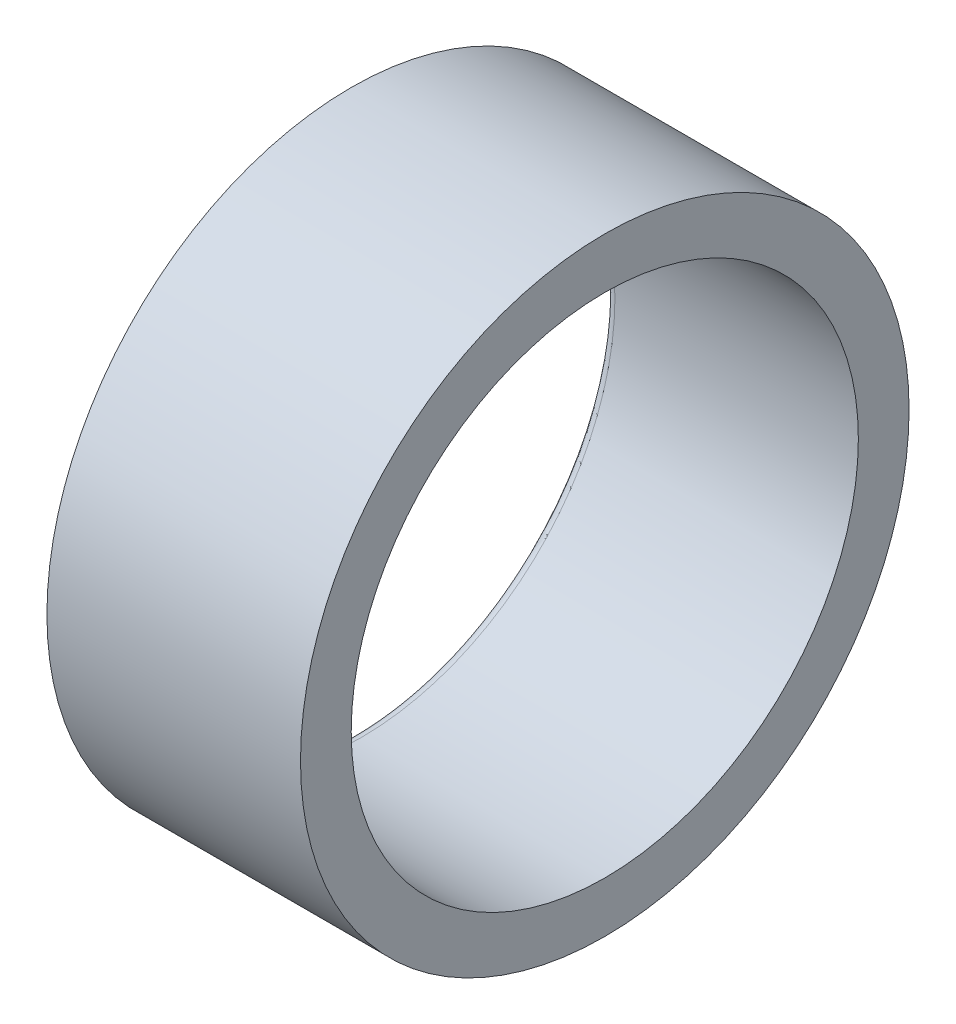
ISO-10303-21;
HEADER;
FILE_DESCRIPTION(('STEP AP214'),'2;1');
FILE_NAME('part.step','',(''),(''),'','','');
FILE_SCHEMA(('AUTOMOTIVE_DESIGN { 1 0 10303 214 1 1 1 1 }'));
ENDSEC;
DATA;
#1=APPLICATION_CONTEXT('core data for automotive mechanical design processes');
#2=APPLICATION_PROTOCOL_DEFINITION('international standard','automotive_design',2000,#1);
#3=PRODUCT_CONTEXT('',#1,'mechanical');
#4=PRODUCT('Part','Part','',(#3));
#5=PRODUCT_RELATED_PRODUCT_CATEGORY('part','',(#4));
#6=PRODUCT_DEFINITION_FORMATION('','',#4);
#7=PRODUCT_DEFINITION_CONTEXT('part definition',#1,'design');
#8=PRODUCT_DEFINITION('design','',#6,#7);
#9=PRODUCT_DEFINITION_SHAPE('','',#8);
#10=(LENGTH_UNIT() NAMED_UNIT(*) SI_UNIT(.MILLI.,.METRE.));
#11=(NAMED_UNIT(*) PLANE_ANGLE_UNIT() SI_UNIT($,.RADIAN.));
#12=(NAMED_UNIT(*) SI_UNIT($,.STERADIAN.) SOLID_ANGLE_UNIT());
#13=UNCERTAINTY_MEASURE_WITH_UNIT(LENGTH_MEASURE(1.E-05),#10,'distance_accuracy_value','');
#14=(GEOMETRIC_REPRESENTATION_CONTEXT(3) GLOBAL_UNCERTAINTY_ASSIGNED_CONTEXT((#13)) GLOBAL_UNIT_ASSIGNED_CONTEXT((#10,
#11,#12)) REPRESENTATION_CONTEXT('',''));
#15=CARTESIAN_POINT('',(0.,0.,0.));
#16=DIRECTION('',(0.,0.,1.));
#17=DIRECTION('',(1.,0.,0.));
#18=AXIS2_PLACEMENT_3D('',#15,#16,#17);
#19=CARTESIAN_POINT('',(5.,5.2,0.));
#20=DIRECTION('',(-1.,0.,0.));
#21=DIRECTION('',(0.,0.,1.));
#22=AXIS2_PLACEMENT_3D('',#19,#20,#21);
#23=PLANE('',#22);
#24=CARTESIAN_POINT('',(5.,0.,0.));
#25=DIRECTION('',(-1.,0.,0.));
#26=DIRECTION('',(0.,0.,1.));
#27=AXIS2_PLACEMENT_3D('',#24,#25,#26);
#28=CIRCLE('',#27,6.);
#29=CARTESIAN_POINT('',(5.,0.,6.));
#30=VERTEX_POINT('',#29);
#31=EDGE_CURVE('E25',#30,#30,#28,.T.);
#32=ORIENTED_EDGE('',*,*,#31,.F.);
#33=EDGE_LOOP('',(#32));
#34=FACE_BOUND('',#33,.T.);
#35=CARTESIAN_POINT('',(5.,0.,0.));
#36=DIRECTION('',(-1.,0.,0.));
#37=DIRECTION('',(0.,0.,1.));
#38=AXIS2_PLACEMENT_3D('',#35,#36,#37);
#39=CIRCLE('',#38,5.);
#40=CARTESIAN_POINT('',(5.,0.,5.));
#41=VERTEX_POINT('',#40);
#42=EDGE_CURVE('E10',#41,#41,#39,.T.);
#43=ORIENTED_EDGE('',*,*,#42,.T.);
#44=EDGE_LOOP('',(#43));
#45=FACE_BOUND('',#44,.T.);
#46=ADVANCED_FACE('F15',(#34,#45),#23,.F.);
#47=CARTESIAN_POINT('',(0.200000000000015,0.,0.));
#48=DIRECTION('',(-1.,0.,0.));
#49=DIRECTION('',(0.,0.,1.));
#50=AXIS2_PLACEMENT_3D('',#47,#48,#49);
#51=TOROIDAL_SURFACE('',#50,5.2,0.200000000000015);
#52=CARTESIAN_POINT('',(0.2,0.,0.));
#53=DIRECTION('',(-1.,0.,0.));
#54=DIRECTION('',(0.,0.,1.));
#55=AXIS2_PLACEMENT_3D('',#52,#53,#54);
#56=CIRCLE('',#55,5.);
#57=CARTESIAN_POINT('',(0.2,0.,5.));
#58=VERTEX_POINT('',#57);
#59=EDGE_CURVE('E21',#58,#58,#56,.T.);
#60=ORIENTED_EDGE('',*,*,#59,.F.);
#61=EDGE_LOOP('',(#60));
#62=FACE_BOUND('',#61,.T.);
#63=CARTESIAN_POINT('',(0.,0.,0.));
#64=DIRECTION('',(-1.,0.,0.));
#65=DIRECTION('',(0.,0.,1.));
#66=AXIS2_PLACEMENT_3D('',#63,#64,#65);
#67=CIRCLE('',#66,5.2);
#68=CARTESIAN_POINT('',(0.,0.,5.2));
#69=VERTEX_POINT('',#68);
#70=EDGE_CURVE('E34',#69,#69,#67,.T.);
#71=ORIENTED_EDGE('',*,*,#70,.T.);
#72=EDGE_LOOP('',(#71));
#73=FACE_BOUND('',#72,.T.);
#74=ADVANCED_FACE('F38',(#62,#73),#51,.T.);
#75=CARTESIAN_POINT('',(50.,0.,0.));
#76=DIRECTION('',(-1.,0.,0.));
#77=DIRECTION('',(0.,0.,1.));
#78=AXIS2_PLACEMENT_3D('',#75,#76,#77);
#79=CYLINDRICAL_SURFACE('',#78,5.);
#80=ORIENTED_EDGE('',*,*,#59,.T.);
#81=EDGE_LOOP('',(#80));
#82=FACE_BOUND('',#81,.T.);
#83=ORIENTED_EDGE('',*,*,#42,.F.);
#84=EDGE_LOOP('',(#83));
#85=FACE_BOUND('',#84,.T.);
#86=ADVANCED_FACE('F49',(#82,#85),#79,.F.);
#87=CARTESIAN_POINT('',(50.,0.,0.));
#88=DIRECTION('',(-1.,0.,0.));
#89=DIRECTION('',(0.,0.,1.));
#90=AXIS2_PLACEMENT_3D('',#87,#88,#89);
#91=CYLINDRICAL_SURFACE('',#90,6.);
#92=CARTESIAN_POINT('',(0.,0.,0.));
#93=DIRECTION('',(-1.,0.,0.));
#94=DIRECTION('',(0.,0.,1.));
#95=AXIS2_PLACEMENT_3D('',#92,#93,#94);
#96=CIRCLE('',#95,6.);
#97=CARTESIAN_POINT('',(0.,0.,6.));
#98=VERTEX_POINT('',#97);
#99=EDGE_CURVE('E30',#98,#98,#96,.T.);
#100=ORIENTED_EDGE('',*,*,#99,.F.);
#101=EDGE_LOOP('',(#100));
#102=FACE_BOUND('',#101,.T.);
#103=ORIENTED_EDGE('',*,*,#31,.T.);
#104=EDGE_LOOP('',(#103));
#105=FACE_BOUND('',#104,.T.);
#106=ADVANCED_FACE('F43',(#102,#105),#91,.T.);
#107=CARTESIAN_POINT('',(0.,6.,0.));
#108=DIRECTION('',(1.,0.,0.));
#109=DIRECTION('',(0.,0.,-1.));
#110=AXIS2_PLACEMENT_3D('',#107,#108,#109);
#111=PLANE('',#110);
#112=ORIENTED_EDGE('',*,*,#70,.F.);
#113=EDGE_LOOP('',(#112));
#114=FACE_BOUND('',#113,.T.);
#115=ORIENTED_EDGE('',*,*,#99,.T.);
#116=EDGE_LOOP('',(#115));
#117=FACE_BOUND('',#116,.T.);
#118=ADVANCED_FACE('F40',(#114,#117),#111,.F.);
#119=CLOSED_SHELL('',(#46,#74,#86,#106,#118));
#120=MANIFOLD_SOLID_BREP('B1',#119);
#121=ADVANCED_BREP_SHAPE_REPRESENTATION('',(#18,#120),#14);
#122=SHAPE_DEFINITION_REPRESENTATION(#9,#121);
ENDSEC;
END-ISO-10303-21;
